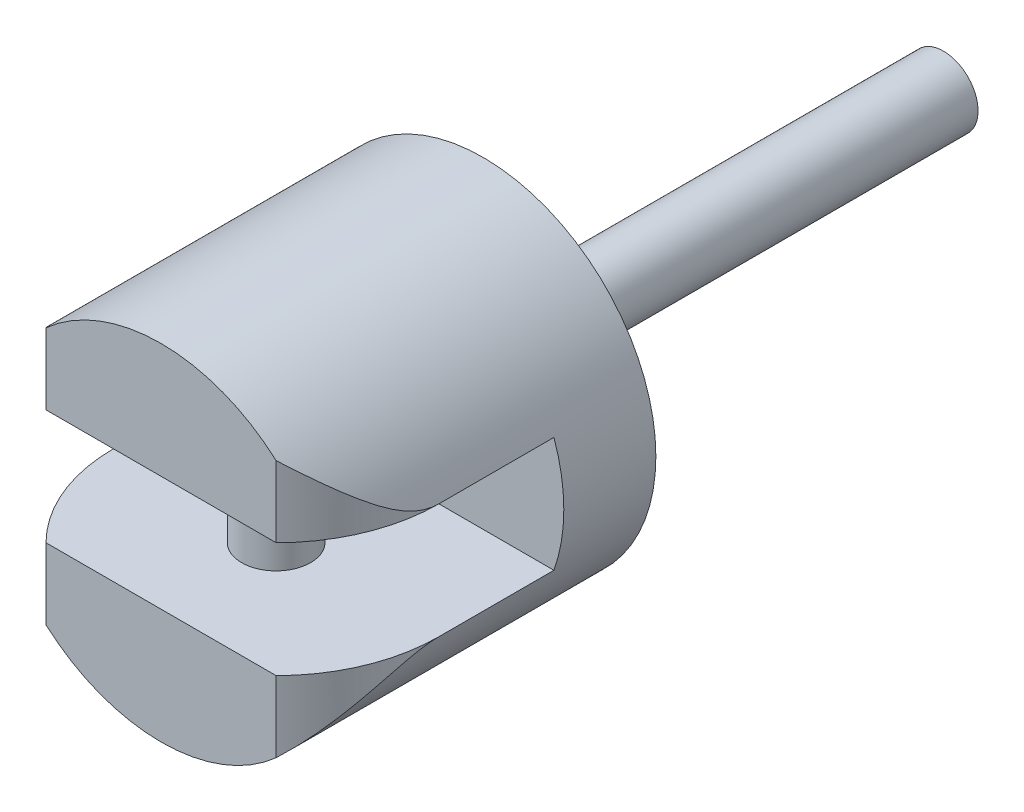
ISO-10303-21;
HEADER;
FILE_DESCRIPTION(('STEP AP214'),'2;1');
FILE_NAME('part.step','',(''),(''),'','','');
FILE_SCHEMA(('AUTOMOTIVE_DESIGN { 1 0 10303 214 1 1 1 1 }'));
ENDSEC;
DATA;
#1=APPLICATION_CONTEXT('core data for automotive mechanical design processes');
#2=APPLICATION_PROTOCOL_DEFINITION('international standard','automotive_design',2000,#1);
#3=PRODUCT_CONTEXT('',#1,'mechanical');
#4=PRODUCT('Part','Part','',(#3));
#5=PRODUCT_RELATED_PRODUCT_CATEGORY('part','',(#4));
#6=PRODUCT_DEFINITION_FORMATION('','',#4);
#7=PRODUCT_DEFINITION_CONTEXT('part definition',#1,'design');
#8=PRODUCT_DEFINITION('design','',#6,#7);
#9=PRODUCT_DEFINITION_SHAPE('','',#8);
#10=(LENGTH_UNIT() NAMED_UNIT(*) SI_UNIT(.MILLI.,.METRE.));
#11=(NAMED_UNIT(*) PLANE_ANGLE_UNIT() SI_UNIT($,.RADIAN.));
#12=(NAMED_UNIT(*) SI_UNIT($,.STERADIAN.) SOLID_ANGLE_UNIT());
#13=UNCERTAINTY_MEASURE_WITH_UNIT(LENGTH_MEASURE(1.E-05),#10,'distance_accuracy_value','');
#14=(GEOMETRIC_REPRESENTATION_CONTEXT(3) GLOBAL_UNCERTAINTY_ASSIGNED_CONTEXT((#13)) GLOBAL_UNIT_ASSIGNED_CONTEXT((#10,
#11,#12)) REPRESENTATION_CONTEXT('',''));
#15=CARTESIAN_POINT('',(0.,0.,0.));
#16=DIRECTION('',(0.,0.,1.));
#17=DIRECTION('',(1.,0.,0.));
#18=AXIS2_PLACEMENT_3D('',#15,#16,#17);
#19=CARTESIAN_POINT('',(0.,0.,40.));
#20=DIRECTION('',(0.,0.,-1.));
#21=DIRECTION('',(-1.,0.,0.));
#22=AXIS2_PLACEMENT_3D('',#19,#20,#21);
#23=CYLINDRICAL_SURFACE('',#22,75.);
#24=CARTESIAN_POINT('',(0.,0.,0.));
#25=DIRECTION('',(0.,0.,1.));
#26=DIRECTION('',(1.,0.,0.));
#27=AXIS2_PLACEMENT_3D('',#24,#25,#26);
#28=CIRCLE('',#27,75.);
#29=CARTESIAN_POINT('',(75.,0.,0.));
#30=VERTEX_POINT('',#29);
#31=EDGE_CURVE('E152',#30,#30,#28,.T.);
#32=ORIENTED_EDGE('',*,*,#31,.T.);
#33=EDGE_LOOP('',(#32));
#34=FACE_BOUND('',#33,.T.);
#35=CARTESIAN_POINT('',(-50.,55.9016994374947,140.));
#36=CARTESIAN_POINT('',(-50.4471607483027,55.5017451255967,139.552833539091));
#37=CARTESIAN_POINT('',(-50.8869348308672,55.0987429884566,139.101068268509));
#38=CARTESIAN_POINT('',(-51.7518329745256,54.2871946058657,138.188619486069));
#39=CARTESIAN_POINT('',(-52.1769575124843,53.8786485414825,137.727936265268));
#40=CARTESIAN_POINT('',(-53.4303839295943,52.645679833325,136.333108012427));
#41=CARTESIAN_POINT('',(-54.2369533553051,51.8137339636996,135.385969254587));
#42=CARTESIAN_POINT('',(-55.7935098678778,50.1337876534138,133.458260519685));
#43=CARTESIAN_POINT('',(-56.543450349325,49.2857746922854,132.477663950042));
#44=CARTESIAN_POINT('',(-57.9869999728488,47.5789554687238,130.484833294683));
#45=CARTESIAN_POINT('',(-58.6806067345314,46.7201487519667,129.472597874561));
#46=CARTESIAN_POINT('',(-60.0195958933229,44.9873320628578,127.405631045393));
#47=CARTESIAN_POINT('',(-60.6643630211661,44.1132588213194,126.350554382454));
#48=CARTESIAN_POINT('',(-61.8978256245699,42.3651194841771,124.208002252363));
#49=CARTESIAN_POINT('',(-62.4865182597134,41.4910533911754,123.120525147648));
#50=CARTESIAN_POINT('',(-63.6077990332285,39.7507040199705,120.91245968818));
#51=CARTESIAN_POINT('',(-64.140428277674,38.8844154715678,119.791896375383));
#52=CARTESIAN_POINT('',(-65.1500238336438,37.1680597886583,117.514115461867));
#53=CARTESIAN_POINT('',(-65.6270008998664,36.3179895466368,116.356904998291));
#54=CARTESIAN_POINT('',(-66.4263470947432,34.8294368347989,114.25919825072));
#55=CARTESIAN_POINT('',(-66.7596869582326,34.185422666996,113.326807142889));
#56=CARTESIAN_POINT('',(-67.3914135449823,32.9225666771076,111.433468032308));
#57=CARTESIAN_POINT('',(-67.6898015217152,32.3037239528235,110.472521055203));
#58=CARTESIAN_POINT('',(-68.2501827844644,31.1022747163517,108.518768575891));
#59=CARTESIAN_POINT('',(-68.5122023846493,30.5196421748037,107.525986754681));
#60=CARTESIAN_POINT('',(-68.9980282729177,29.4047807666676,105.503340586175));
#61=CARTESIAN_POINT('',(-69.2218453519084,28.8725376857582,104.473486810296));
#62=CARTESIAN_POINT('',(-69.5690994945685,28.0229578060447,102.6773988872));
#63=CARTESIAN_POINT('',(-69.702810970304,27.6881005070611,101.921470311479));
#64=CARTESIAN_POINT('',(-69.947860150658,27.0630643717184,100.387497738915));
#65=CARTESIAN_POINT('',(-70.0591956025663,26.7728900345117,99.6094515243642));
#66=CARTESIAN_POINT('',(-70.2570736156081,26.2492241500369,98.0355083858782));
#67=CARTESIAN_POINT('',(-70.343735556161,26.0154605353032,97.2397182217052));
#68=CARTESIAN_POINT('',(-70.4908565044235,25.6141596316633,95.6295350723351));
#69=CARTESIAN_POINT('',(-70.5513347278745,25.4465737840955,94.8151561926975));
#70=CARTESIAN_POINT('',(-70.6350310190156,25.2131821979663,93.3357199927336));
#71=CARTESIAN_POINT('',(-70.6632621452806,25.1337766445926,92.6731093341303));
#72=CARTESIAN_POINT('',(-70.691641677123,25.0537926250238,91.6743651952552));
#73=CARTESIAN_POINT('',(-70.6987738511222,25.0336511172486,91.3399123588628));
#74=CARTESIAN_POINT('',(-70.708294468237,25.0067428591615,90.6703188165184));
#75=CARTESIAN_POINT('',(-70.7106817216347,24.999979463213,90.3351779591362));
#76=CARTESIAN_POINT('',(-70.7106781186548,24.9999999999999,90.));
#77=B_SPLINE_CURVE_WITH_KNOTS('',3,(#35,#36,#37,#38,#39,#40,#41,#42,#43,#44,#45,#46,#47,#48,#49,
#50,#51,#52,#53,#54,#55,#56,#57,#58,#59,#60,#61,#62,#63,#64,#65,#66,#67,#68,#69,#70,#71,#72,#73,
#74,#75,#76),.UNSPECIFIED.,.F.,.F.,(4,2,2,2,2,2,2,2,2,2,2,2,2,2,2,2,2,2,2,2,4),(0.,
2.24461722278169,4.48916131072646,8.97717086504265,13.4688346638826,17.9606881603535,
22.5020139359566,27.04356962728,31.5817718758783,36.1190956661773,39.6617360524355,
43.2042493507598,46.7441859676835,50.2831210127475,52.7942338263427,55.3055993201878,
57.8045989945119,60.3017615779778,62.3032570375314,63.3083909087766,64.3137767705253),.UNSPECIFIED.);
#78=CARTESIAN_POINT('',(-50.,55.9016994374948,140.));
#79=VERTEX_POINT('',#78);
#80=CARTESIAN_POINT('',(-70.7106781186548,25.,90.));
#81=VERTEX_POINT('',#80);
#82=EDGE_CURVE('E213',#79,#81,#77,.T.);
#83=ORIENTED_EDGE('',*,*,#82,.F.);
#84=CARTESIAN_POINT('',(0.,0.,140.));
#85=DIRECTION('',(0.,0.,1.));
#86=DIRECTION('',(1.,0.,0.));
#87=AXIS2_PLACEMENT_3D('',#84,#85,#86);
#88=CIRCLE('',#87,75.);
#89=CARTESIAN_POINT('',(50.,55.9016994374948,140.));
#90=VERTEX_POINT('',#89);
#91=EDGE_CURVE('E167',#90,#79,#88,.T.);
#92=ORIENTED_EDGE('',*,*,#91,.F.);
#93=CARTESIAN_POINT('',(70.7106781186548,25.,90.));
#94=CARTESIAN_POINT('',(70.71069664,24.9999037239482,90.4591966566404));
#95=CARTESIAN_POINT('',(70.7062056844189,25.0126490802113,90.918354215152));
#96=CARTESIAN_POINT('',(70.6883459813921,25.0631011269385,91.8349637380874));
#97=CARTESIAN_POINT('',(70.6749804143905,25.100798875059,92.2924162545173));
#98=CARTESIAN_POINT('',(70.6395818305565,25.20023987016,93.2025359123625));
#99=CARTESIAN_POINT('',(70.6175829204928,25.2618884876571,93.6552147727632));
#100=CARTESIAN_POINT('',(70.5651699456891,25.407927905513,94.5563802699263));
#101=CARTESIAN_POINT('',(70.5347552569245,25.492320392303,95.0048665932645));
#102=CARTESIAN_POINT('',(70.4328464268791,25.773114610417,96.3228553791904));
#103=CARTESIAN_POINT('',(70.3498677914168,25.9994956446317,97.1852074308121));
#104=CARTESIAN_POINT('',(70.1553031320753,26.5199954287679,98.8864118724804));
#105=CARTESIAN_POINT('',(70.0436855884274,26.8141887759228,99.7252372335777));
#106=CARTESIAN_POINT('',(69.8207920938738,27.3885157038499,101.2022408254));
#107=CARTESIAN_POINT('',(69.7144696159016,27.6583856987452,101.845225208063));
#108=CARTESIAN_POINT('',(69.4865831703183,28.226020920803,103.116082915582));
#109=CARTESIAN_POINT('',(69.3650164108099,28.5237912552106,103.743953447257));
#110=CARTESIAN_POINT('',(69.1074338107972,29.1423212343323,104.985483193627));
#111=CARTESIAN_POINT('',(68.9714122948302,29.4630898928236,105.599136710164));
#112=CARTESIAN_POINT('',(68.6856165444134,30.123338185786,106.812935287153));
#113=CARTESIAN_POINT('',(68.5358430172439,30.462816857623,107.413081040348));
#114=CARTESIAN_POINT('',(68.2196997439472,31.1644627238597,108.613599314781));
#115=CARTESIAN_POINT('',(68.0530439672477,31.5269595532607,109.213703188681));
#116=CARTESIAN_POINT('',(67.706309476017,32.2648734090124,110.40192444328));
#117=CARTESIAN_POINT('',(67.5262307511406,32.6402904453208,110.990041814742));
#118=CARTESIAN_POINT('',(66.9663751944478,33.7819731884777,112.737685328915));
#119=CARTESIAN_POINT('',(66.5669063211661,34.563833544468,113.880776768079));
#120=CARTESIAN_POINT('',(65.683368993561,36.2166009609941,116.217862521279));
#121=CARTESIAN_POINT('',(65.1951077194911,37.0896590264,117.408728755374));
#122=CARTESIAN_POINT('',(64.1597771209223,38.8531732101764,119.751692585025));
#123=CARTESIAN_POINT('',(63.6126965840236,39.7436326191063,120.90378273375));
#124=CARTESIAN_POINT('',(62.4593809208052,41.5326325183435,123.172978061962));
#125=CARTESIAN_POINT('',(61.8531045084909,42.4311782461494,124.290058096017));
#126=CARTESIAN_POINT('',(60.581286594272,44.2280386628488,126.490022967266));
#127=CARTESIAN_POINT('',(59.9157486694529,45.1263533624091,127.572909863055));
#128=CARTESIAN_POINT('',(58.5613873550057,46.8691454747357,129.648672538627));
#129=CARTESIAN_POINT('',(57.8756526338992,47.7139594790385,130.64328100435));
#130=CARTESIAN_POINT('',(56.4495700180813,49.3929067339749,132.60179972503));
#131=CARTESIAN_POINT('',(55.7092248956424,50.2270405242655,133.565711534738));
#132=CARTESIAN_POINT('',(54.1736544575359,51.8795352978065,135.460985733273));
#133=CARTESIAN_POINT('',(53.3784772593276,52.6979093239244,136.392375606794));
#134=CARTESIAN_POINT('',(52.1434907927725,53.9109405027724,137.764370056649));
#135=CARTESIAN_POINT('',(51.7247386534705,54.3129103274674,138.217573113012));
#136=CARTESIAN_POINT('',(50.8730429522221,55.1114709117659,139.115336067717));
#137=CARTESIAN_POINT('',(50.4400989454209,55.5080615022014,139.559895694429));
#138=CARTESIAN_POINT('',(50.,55.9016994374947,140.));
#139=B_SPLINE_CURVE_WITH_KNOTS('',3,(#93,#94,#95,#96,#97,#98,#99,#100,#101,#102,#103,#104,#105,
#106,#107,#108,#109,#110,#111,#112,#113,#114,#115,#116,#117,#118,#119,#120,#121,#122,#123,#124,
#125,#126,#127,#128,#129,#130,#131,#132,#133,#134,#135,#136,#137,#138),.UNSPECIFIED.,.F.,.F.,(4,
2,2,2,2,2,2,2,2,2,2,2,2,2,2,2,2,2,2,2,2,2,4),(0.,1.37732730415904,2.75416127403436,
4.12560982879987,5.49716010285156,8.17913914004191,10.8640827004156,12.9792840690535,
15.094873391255,17.2112964614591,19.327610742721,21.4891024092348,23.6505957416502,
27.9726031384433,32.6365608525402,37.3014092134564,41.9695346210165,46.6373784465176,
51.0585714589686,55.4795401857878,59.8966775210212,62.1057806652428,64.3149531218),.UNSPECIFIED.);
#140=CARTESIAN_POINT('',(70.7106781186548,25.,90.));
#141=VERTEX_POINT('',#140);
#142=EDGE_CURVE('E221',#141,#90,#139,.T.);
#143=ORIENTED_EDGE('',*,*,#142,.F.);
#144=DIRECTION('',(0.,0.,-1.));
#145=VECTOR('',#144,1.);
#146=CARTESIAN_POINT('',(70.7106781186548,25.,140.));
#147=LINE('',#146,#145);
#148=CARTESIAN_POINT('',(70.7106781186548,25.,40.));
#149=VERTEX_POINT('',#148);
#150=EDGE_CURVE('E177',#141,#149,#147,.T.);
#151=ORIENTED_EDGE('',*,*,#150,.T.);
#152=CARTESIAN_POINT('',(0.,0.,40.));
#153=DIRECTION('',(0.,0.,1.));
#154=DIRECTION('',(1.,0.,0.));
#155=AXIS2_PLACEMENT_3D('',#152,#153,#154);
#156=CIRCLE('',#155,75.);
#157=CARTESIAN_POINT('',(70.7106781186548,-25.,40.));
#158=VERTEX_POINT('',#157);
#159=EDGE_CURVE('E132',#158,#149,#156,.T.);
#160=ORIENTED_EDGE('',*,*,#159,.F.);
#161=DIRECTION('',(0.,0.,-1.));
#162=VECTOR('',#161,1.);
#163=CARTESIAN_POINT('',(70.7106781186548,-25.,140.));
#164=LINE('',#163,#162);
#165=CARTESIAN_POINT('',(70.7106781186548,-25.,90.));
#166=VERTEX_POINT('',#165);
#167=EDGE_CURVE('E122',#166,#158,#164,.T.);
#168=ORIENTED_EDGE('',*,*,#167,.F.);
#169=CARTESIAN_POINT('',(50.,-55.9016994374947,140.));
#170=CARTESIAN_POINT('',(50.4471607483027,-55.5017451255967,139.552833539091));
#171=CARTESIAN_POINT('',(50.8869348308672,-55.0987429884566,139.101068268509));
#172=CARTESIAN_POINT('',(51.7518329745256,-54.2871946058657,138.188619486069));
#173=CARTESIAN_POINT('',(52.1769575124843,-53.8786485414825,137.727936265268));
#174=CARTESIAN_POINT('',(53.4303839295943,-52.645679833325,136.333108012427));
#175=CARTESIAN_POINT('',(54.2369533553051,-51.8137339636997,135.385969254587));
#176=CARTESIAN_POINT('',(55.7935098678778,-50.1337876534138,133.458260519685));
#177=CARTESIAN_POINT('',(56.5434503493249,-49.2857746922854,132.477663950042));
#178=CARTESIAN_POINT('',(57.9869999728487,-47.5789554687238,130.484833294683));
#179=CARTESIAN_POINT('',(58.6806067345313,-46.7201487519667,129.472597874561));
#180=CARTESIAN_POINT('',(60.0195958933229,-44.9873320628578,127.405631045393));
#181=CARTESIAN_POINT('',(60.664363021166,-44.1132588213194,126.350554382454));
#182=CARTESIAN_POINT('',(61.8978256245699,-42.3651194841771,124.208002252364));
#183=CARTESIAN_POINT('',(62.4865182597134,-41.4910533911754,123.120525147648));
#184=CARTESIAN_POINT('',(63.6077990332285,-39.7507040199705,120.91245968818));
#185=CARTESIAN_POINT('',(64.140428277674,-38.8844154715678,119.791896375383));
#186=CARTESIAN_POINT('',(65.1500238336438,-37.1680597886583,117.514115461867));
#187=CARTESIAN_POINT('',(65.6270008998664,-36.3179895466368,116.356904998291));
#188=CARTESIAN_POINT('',(66.4263470947433,-34.8294368347989,114.25919825072));
#189=CARTESIAN_POINT('',(66.7596869582326,-34.185422666996,113.326807142889));
#190=CARTESIAN_POINT('',(67.3914135449823,-32.9225666771076,111.433468032308));
#191=CARTESIAN_POINT('',(67.6898015217152,-32.3037239528235,110.472521055203));
#192=CARTESIAN_POINT('',(68.2501827844644,-31.1022747163517,108.518768575891));
#193=CARTESIAN_POINT('',(68.5122023846493,-30.5196421748037,107.525986754681));
#194=CARTESIAN_POINT('',(68.9980282729177,-29.4047807666676,105.503340586175));
#195=CARTESIAN_POINT('',(69.2218453519084,-28.8725376857583,104.473486810296));
#196=CARTESIAN_POINT('',(69.5690994945685,-28.0229578060447,102.6773988872));
#197=CARTESIAN_POINT('',(69.7028109703039,-27.6881005070611,101.921470311479));
#198=CARTESIAN_POINT('',(69.947860150658,-27.0630643717184,100.387497738915));
#199=CARTESIAN_POINT('',(70.0591956025663,-26.7728900345117,99.6094515243643));
#200=CARTESIAN_POINT('',(70.2570736156081,-26.249224150037,98.0355083858782));
#201=CARTESIAN_POINT('',(70.343735556161,-26.0154605353032,97.2397182217051));
#202=CARTESIAN_POINT('',(70.4908565044235,-25.6141596316633,95.6295350723351));
#203=CARTESIAN_POINT('',(70.5513347278745,-25.4465737840956,94.8151561926975));
#204=CARTESIAN_POINT('',(70.6350310190156,-25.2131821979663,93.3357199927336));
#205=CARTESIAN_POINT('',(70.6632621452806,-25.1337766445926,92.6731093341303));
#206=CARTESIAN_POINT('',(70.691641677123,-25.0537926250238,91.6743651952552));
#207=CARTESIAN_POINT('',(70.6987738511222,-25.0336511172486,91.3399123588628));
#208=CARTESIAN_POINT('',(70.708294468237,-25.0067428591615,90.6703188165184));
#209=CARTESIAN_POINT('',(70.7106817216347,-24.999979463213,90.3351779591362));
#210=CARTESIAN_POINT('',(70.7106781186548,-24.9999999999999,90.));
#211=B_SPLINE_CURVE_WITH_KNOTS('',3,(#169,#170,#171,#172,#173,#174,#175,#176,#177,#178,#179,
#180,#181,#182,#183,#184,#185,#186,#187,#188,#189,#190,#191,#192,#193,#194,#195,#196,#197,#198,
#199,#200,#201,#202,#203,#204,#205,#206,#207,#208,#209,#210),.UNSPECIFIED.,.F.,.F.,(4,2,2,2,2,2,
2,2,2,2,2,2,2,2,2,2,2,2,2,2,4),(0.,2.24461722278169,4.48916131072646,8.97717086504263,
13.4688346638826,17.9606881603535,22.5020139359566,27.04356962728,31.5817718758783,
36.1190956661773,39.6617360524355,43.2042493507598,46.7441859676835,50.2831210127475,
52.7942338263426,55.3055993201878,57.8045989945119,60.3017615779778,62.3032570375314,
63.3083909087766,64.3137767705253),.UNSPECIFIED.);
#212=CARTESIAN_POINT('',(50.,-55.9016994374948,140.));
#213=VERTEX_POINT('',#212);
#214=EDGE_CURVE('E109',#213,#166,#211,.T.);
#215=ORIENTED_EDGE('',*,*,#214,.F.);
#216=CARTESIAN_POINT('',(0.,0.,140.));
#217=DIRECTION('',(0.,0.,1.));
#218=DIRECTION('',(1.,0.,0.));
#219=AXIS2_PLACEMENT_3D('',#216,#217,#218);
#220=CIRCLE('',#219,75.);
#221=CARTESIAN_POINT('',(-50.,-55.9016994374948,140.));
#222=VERTEX_POINT('',#221);
#223=EDGE_CURVE('E146',#222,#213,#220,.T.);
#224=ORIENTED_EDGE('',*,*,#223,.F.);
#225=CARTESIAN_POINT('',(-70.7106781186548,-25.,90.));
#226=CARTESIAN_POINT('',(-70.71069664,-24.9999037239483,90.4591966566404));
#227=CARTESIAN_POINT('',(-70.7062056844189,-25.0126490802113,90.918354215152));
#228=CARTESIAN_POINT('',(-70.6883459813921,-25.0631011269385,91.8349637380874));
#229=CARTESIAN_POINT('',(-70.6749804143905,-25.100798875059,92.2924162545173));
#230=CARTESIAN_POINT('',(-70.6395818305565,-25.20023987016,93.2025359123625));
#231=CARTESIAN_POINT('',(-70.6175829204928,-25.2618884876571,93.6552147727632));
#232=CARTESIAN_POINT('',(-70.5651699456891,-25.407927905513,94.5563802699263));
#233=CARTESIAN_POINT('',(-70.5347552569245,-25.4923203923029,95.0048665932645));
#234=CARTESIAN_POINT('',(-70.4328464268792,-25.7731146104169,96.3228553791903));
#235=CARTESIAN_POINT('',(-70.3498677914168,-25.9994956446317,97.185207430812));
#236=CARTESIAN_POINT('',(-70.1553031320753,-26.519995428768,98.8864118724804));
#237=CARTESIAN_POINT('',(-70.0436855884274,-26.8141887759228,99.7252372335777));
#238=CARTESIAN_POINT('',(-69.8207920938738,-27.3885157038499,101.2022408254));
#239=CARTESIAN_POINT('',(-69.7144696159016,-27.6583856987452,101.845225208063));
#240=CARTESIAN_POINT('',(-69.4865831703183,-28.226020920803,103.116082915582));
#241=CARTESIAN_POINT('',(-69.3650164108099,-28.5237912552106,103.743953447257));
#242=CARTESIAN_POINT('',(-69.1074338107972,-29.1423212343323,104.985483193627));
#243=CARTESIAN_POINT('',(-68.9714122948302,-29.4630898928236,105.599136710164));
#244=CARTESIAN_POINT('',(-68.6856165444134,-30.123338185786,106.812935287153));
#245=CARTESIAN_POINT('',(-68.5358430172439,-30.462816857623,107.413081040348));
#246=CARTESIAN_POINT('',(-68.2196997439473,-31.1644627238597,108.613599314781));
#247=CARTESIAN_POINT('',(-68.0530439672477,-31.5269595532607,109.21370318868));
#248=CARTESIAN_POINT('',(-67.706309476017,-32.2648734090124,110.40192444328));
#249=CARTESIAN_POINT('',(-67.5262307511406,-32.6402904453208,110.990041814742));
#250=CARTESIAN_POINT('',(-66.9663751944478,-33.7819731884777,112.737685328915));
#251=CARTESIAN_POINT('',(-66.5669063211661,-34.563833544468,113.880776768079));
#252=CARTESIAN_POINT('',(-65.683368993561,-36.2166009609941,116.217862521279));
#253=CARTESIAN_POINT('',(-65.1951077194911,-37.0896590264,117.408728755374));
#254=CARTESIAN_POINT('',(-64.1597771209223,-38.8531732101764,119.751692585025));
#255=CARTESIAN_POINT('',(-63.6126965840236,-39.7436326191063,120.90378273375));
#256=CARTESIAN_POINT('',(-62.4593809208052,-41.5326325183435,123.172978061962));
#257=CARTESIAN_POINT('',(-61.8531045084909,-42.4311782461494,124.290058096017));
#258=CARTESIAN_POINT('',(-60.581286594272,-44.2280386628488,126.490022967266));
#259=CARTESIAN_POINT('',(-59.9157486694529,-45.1263533624091,127.572909863055));
#260=CARTESIAN_POINT('',(-58.5613873550057,-46.8691454747357,129.648672538627));
#261=CARTESIAN_POINT('',(-57.8756526338992,-47.7139594790385,130.64328100435));
#262=CARTESIAN_POINT('',(-56.4495700180813,-49.3929067339749,132.60179972503));
#263=CARTESIAN_POINT('',(-55.7092248956424,-50.2270405242655,133.565711534738));
#264=CARTESIAN_POINT('',(-54.1736544575359,-51.8795352978065,135.460985733273));
#265=CARTESIAN_POINT('',(-53.3784772593276,-52.6979093239244,136.392375606794));
#266=CARTESIAN_POINT('',(-52.1434907927725,-53.9109405027724,137.764370056649));
#267=CARTESIAN_POINT('',(-51.7247386534705,-54.3129103274673,138.217573113012));
#268=CARTESIAN_POINT('',(-50.8730429522221,-55.1114709117659,139.115336067717));
#269=CARTESIAN_POINT('',(-50.4400989454209,-55.5080615022014,139.559895694429));
#270=CARTESIAN_POINT('',(-50.,-55.9016994374947,140.));
#271=B_SPLINE_CURVE_WITH_KNOTS('',3,(#225,#226,#227,#228,#229,#230,#231,#232,#233,#234,#235,
#236,#237,#238,#239,#240,#241,#242,#243,#244,#245,#246,#247,#248,#249,#250,#251,#252,#253,#254,
#255,#256,#257,#258,#259,#260,#261,#262,#263,#264,#265,#266,#267,#268,#269,#270),.UNSPECIFIED.,
.F.,.F.,(4,2,2,2,2,2,2,2,2,2,2,2,2,2,2,2,2,2,2,2,2,2,4),(0.,1.37732730415904,2.75416127403437,
4.12560982879989,5.49716010285155,8.17913914004189,10.8640827004156,12.9792840690535,
15.094873391255,17.2112964614591,19.327610742721,21.4891024092348,23.6505957416502,
27.9726031384433,32.6365608525401,37.3014092134564,41.9695346210165,46.6373784465176,
51.0585714589686,55.4795401857878,59.8966775210212,62.1057806652428,64.3149531218),.UNSPECIFIED.);
#272=CARTESIAN_POINT('',(-70.7106781186548,-25.,90.));
#273=VERTEX_POINT('',#272);
#274=EDGE_CURVE('E69',#273,#222,#271,.T.);
#275=ORIENTED_EDGE('',*,*,#274,.F.);
#276=DIRECTION('',(0.,0.,-1.));
#277=VECTOR('',#276,1.);
#278=CARTESIAN_POINT('',(-70.7106781186548,-25.,140.));
#279=LINE('',#278,#277);
#280=CARTESIAN_POINT('',(-70.7106781186548,-25.,40.));
#281=VERTEX_POINT('',#280);
#282=EDGE_CURVE('E133',#273,#281,#279,.T.);
#283=ORIENTED_EDGE('',*,*,#282,.T.);
#284=CARTESIAN_POINT('',(-70.7106781186548,25.,40.));
#285=VERTEX_POINT('',#284);
#286=EDGE_CURVE('E156',#285,#281,#156,.T.);
#287=ORIENTED_EDGE('',*,*,#286,.F.);
#288=DIRECTION('',(0.,0.,-1.));
#289=VECTOR('',#288,1.);
#290=CARTESIAN_POINT('',(-70.7106781186548,25.,140.));
#291=LINE('',#290,#289);
#292=EDGE_CURVE('E140',#81,#285,#291,.T.);
#293=ORIENTED_EDGE('',*,*,#292,.F.);
#294=EDGE_LOOP('',(#83,#92,#143,#151,#160,#168,#215,#224,#275,#283,#287,#293));
#295=FACE_BOUND('',#294,.T.);
#296=ADVANCED_FACE('F46',(#34,#295),#23,.T.);
#297=CARTESIAN_POINT('',(70.7106781186548,-25.,140.));
#298=DIRECTION('',(0.,-1.,0.));
#299=DIRECTION('',(0.,0.,-1.));
#300=AXIS2_PLACEMENT_3D('',#297,#298,#299);
#301=PLANE('',#300);
#302=CARTESIAN_POINT('',(0.,-25.,90.));
#303=DIRECTION('',(0.,-1.,0.));
#304=DIRECTION('',(1.,0.,0.));
#305=AXIS2_PLACEMENT_3D('',#302,#303,#304);
#306=CIRCLE('',#305,15.);
#307=CARTESIAN_POINT('',(15.,-25.,90.));
#308=VERTEX_POINT('',#307);
#309=EDGE_CURVE('E134',#308,#308,#306,.T.);
#310=ORIENTED_EDGE('',*,*,#309,.T.);
#311=EDGE_LOOP('',(#310));
#312=FACE_BOUND('',#311,.T.);
#313=CARTESIAN_POINT('',(0.,-25.,90.));
#314=DIRECTION('',(0.,-1.,0.));
#315=DIRECTION('',(0.,0.,-1.));
#316=AXIS2_PLACEMENT_3D('',#313,#314,#315);
#317=CIRCLE('',#316,70.7106781186548);
#318=CARTESIAN_POINT('',(50.,-25.,140.));
#319=VERTEX_POINT('',#318);
#320=EDGE_CURVE('E61',#166,#319,#317,.T.);
#321=ORIENTED_EDGE('',*,*,#320,.F.);
#322=ORIENTED_EDGE('',*,*,#167,.T.);
#323=DIRECTION('',(-1.,0.,0.));
#324=VECTOR('',#323,1.);
#325=CARTESIAN_POINT('',(70.7106781186548,-25.,40.));
#326=LINE('',#325,#324);
#327=EDGE_CURVE('E143',#158,#281,#326,.T.);
#328=ORIENTED_EDGE('',*,*,#327,.T.);
#329=ORIENTED_EDGE('',*,*,#282,.F.);
#330=CARTESIAN_POINT('',(-50.,-25.,140.));
#331=VERTEX_POINT('',#330);
#332=EDGE_CURVE('E128',#331,#273,#317,.T.);
#333=ORIENTED_EDGE('',*,*,#332,.F.);
#334=DIRECTION('',(-1.,0.,0.));
#335=VECTOR('',#334,1.);
#336=CARTESIAN_POINT('',(70.7106781186548,-25.,140.));
#337=LINE('',#336,#335);
#338=EDGE_CURVE('E126',#319,#331,#337,.T.);
#339=ORIENTED_EDGE('',*,*,#338,.F.);
#340=EDGE_LOOP('',(#321,#322,#328,#329,#333,#339));
#341=FACE_BOUND('',#340,.T.);
#342=ADVANCED_FACE('F120',(#312,#341),#301,.F.);
#343=CARTESIAN_POINT('',(0.,0.,140.));
#344=DIRECTION('',(0.,0.,1.));
#345=DIRECTION('',(1.,0.,0.));
#346=AXIS2_PLACEMENT_3D('',#343,#344,#345);
#347=PLANE('',#346);
#348=ORIENTED_EDGE('',*,*,#223,.T.);
#349=DIRECTION('',(0.,1.,0.));
#350=VECTOR('',#349,1.);
#351=CARTESIAN_POINT('',(50.,-75.,140.));
#352=LINE('',#351,#350);
#353=EDGE_CURVE('E111',#213,#319,#352,.T.);
#354=ORIENTED_EDGE('',*,*,#353,.T.);
#355=ORIENTED_EDGE('',*,*,#338,.T.);
#356=DIRECTION('',(0.,1.,0.));
#357=VECTOR('',#356,1.);
#358=CARTESIAN_POINT('',(-50.,-75.,140.));
#359=LINE('',#358,#357);
#360=EDGE_CURVE('E188',#331,#222,#359,.F.);
#361=ORIENTED_EDGE('',*,*,#360,.T.);
#362=EDGE_LOOP('',(#348,#354,#355,#361));
#363=FACE_BOUND('',#362,.T.);
#364=ADVANCED_FACE('F190',(#363),#347,.T.);
#365=CARTESIAN_POINT('',(-70.7106781186548,25.,140.));
#366=DIRECTION('',(0.,1.,0.));
#367=DIRECTION('',(0.,0.,1.));
#368=AXIS2_PLACEMENT_3D('',#365,#366,#367);
#369=PLANE('',#368);
#370=CARTESIAN_POINT('',(0.,25.,90.));
#371=DIRECTION('',(0.,-1.,0.));
#372=DIRECTION('',(1.,0.,0.));
#373=AXIS2_PLACEMENT_3D('',#370,#371,#372);
#374=CIRCLE('',#373,15.);
#375=CARTESIAN_POINT('',(15.,25.,90.));
#376=VERTEX_POINT('',#375);
#377=EDGE_CURVE('E116',#376,#376,#374,.T.);
#378=ORIENTED_EDGE('',*,*,#377,.F.);
#379=EDGE_LOOP('',(#378));
#380=FACE_BOUND('',#379,.T.);
#381=CARTESIAN_POINT('',(0.,25.,90.));
#382=DIRECTION('',(0.,1.,0.));
#383=DIRECTION('',(0.,0.,1.));
#384=AXIS2_PLACEMENT_3D('',#381,#382,#383);
#385=CIRCLE('',#384,70.7106781186548);
#386=CARTESIAN_POINT('',(50.,25.,140.));
#387=VERTEX_POINT('',#386);
#388=EDGE_CURVE('E176',#387,#141,#385,.T.);
#389=ORIENTED_EDGE('',*,*,#388,.F.);
#390=DIRECTION('',(1.,0.,0.));
#391=VECTOR('',#390,1.);
#392=CARTESIAN_POINT('',(-70.7106781186548,25.,140.));
#393=LINE('',#392,#391);
#394=CARTESIAN_POINT('',(-50.,25.,140.));
#395=VERTEX_POINT('',#394);
#396=EDGE_CURVE('E165',#395,#387,#393,.T.);
#397=ORIENTED_EDGE('',*,*,#396,.F.);
#398=EDGE_CURVE('E173',#81,#395,#385,.T.);
#399=ORIENTED_EDGE('',*,*,#398,.F.);
#400=ORIENTED_EDGE('',*,*,#292,.T.);
#401=DIRECTION('',(1.,0.,0.));
#402=VECTOR('',#401,1.);
#403=CARTESIAN_POINT('',(-70.7106781186548,25.,40.));
#404=LINE('',#403,#402);
#405=EDGE_CURVE('E145',#285,#149,#404,.T.);
#406=ORIENTED_EDGE('',*,*,#405,.T.);
#407=ORIENTED_EDGE('',*,*,#150,.F.);
#408=EDGE_LOOP('',(#389,#397,#399,#400,#406,#407));
#409=FACE_BOUND('',#408,.T.);
#410=ADVANCED_FACE('F172',(#380,#409),#369,.F.);
#411=CARTESIAN_POINT('',(0.,0.,140.));
#412=DIRECTION('',(0.,0.,1.));
#413=DIRECTION('',(1.,0.,0.));
#414=AXIS2_PLACEMENT_3D('',#411,#412,#413);
#415=PLANE('',#414);
#416=ORIENTED_EDGE('',*,*,#396,.T.);
#417=DIRECTION('',(0.,1.,0.));
#418=VECTOR('',#417,1.);
#419=CARTESIAN_POINT('',(50.,-75.,140.));
#420=LINE('',#419,#418);
#421=EDGE_CURVE('E12',#387,#90,#420,.T.);
#422=ORIENTED_EDGE('',*,*,#421,.T.);
#423=ORIENTED_EDGE('',*,*,#91,.T.);
#424=DIRECTION('',(0.,1.,0.));
#425=VECTOR('',#424,1.);
#426=CARTESIAN_POINT('',(-50.,-75.,140.));
#427=LINE('',#426,#425);
#428=EDGE_CURVE('E54',#79,#395,#427,.F.);
#429=ORIENTED_EDGE('',*,*,#428,.T.);
#430=EDGE_LOOP('',(#416,#422,#423,#429));
#431=FACE_BOUND('',#430,.T.);
#432=ADVANCED_FACE('F164',(#431),#415,.T.);
#433=CARTESIAN_POINT('',(0.,0.,40.));
#434=DIRECTION('',(0.,0.,1.));
#435=DIRECTION('',(1.,0.,0.));
#436=AXIS2_PLACEMENT_3D('',#433,#434,#435);
#437=PLANE('',#436);
#438=ORIENTED_EDGE('',*,*,#405,.F.);
#439=ORIENTED_EDGE('',*,*,#286,.T.);
#440=ORIENTED_EDGE('',*,*,#327,.F.);
#441=ORIENTED_EDGE('',*,*,#159,.T.);
#442=EDGE_LOOP('',(#438,#439,#440,#441));
#443=FACE_BOUND('',#442,.T.);
#444=ADVANCED_FACE('F186',(#443),#437,.T.);
#445=CARTESIAN_POINT('',(0.,0.,0.));
#446=DIRECTION('',(0.,0.,1.));
#447=DIRECTION('',(1.,0.,0.));
#448=AXIS2_PLACEMENT_3D('',#445,#446,#447);
#449=PLANE('',#448);
#450=CARTESIAN_POINT('',(0.,0.,0.));
#451=DIRECTION('',(0.,0.,-1.));
#452=DIRECTION('',(-1.,0.,0.));
#453=AXIS2_PLACEMENT_3D('',#450,#451,#452);
#454=CIRCLE('',#453,15.);
#455=CARTESIAN_POINT('',(-15.,0.,0.));
#456=VERTEX_POINT('',#455);
#457=EDGE_CURVE('E153',#456,#456,#454,.T.);
#458=ORIENTED_EDGE('',*,*,#457,.F.);
#459=EDGE_LOOP('',(#458));
#460=FACE_BOUND('',#459,.T.);
#461=ORIENTED_EDGE('',*,*,#31,.F.);
#462=EDGE_LOOP('',(#461));
#463=FACE_BOUND('',#462,.T.);
#464=ADVANCED_FACE('F247',(#460,#463),#449,.F.);
#465=CARTESIAN_POINT('',(0.,0.,-200.));
#466=DIRECTION('',(0.,0.,1.));
#467=DIRECTION('',(1.,0.,0.));
#468=AXIS2_PLACEMENT_3D('',#465,#466,#467);
#469=CYLINDRICAL_SURFACE('',#468,15.);
#470=CARTESIAN_POINT('',(0.,0.,-200.));
#471=DIRECTION('',(0.,0.,-1.));
#472=DIRECTION('',(-1.,0.,0.));
#473=AXIS2_PLACEMENT_3D('',#470,#471,#472);
#474=CIRCLE('',#473,15.);
#475=CARTESIAN_POINT('',(-15.,0.,-200.));
#476=VERTEX_POINT('',#475);
#477=EDGE_CURVE('E149',#476,#476,#474,.T.);
#478=ORIENTED_EDGE('',*,*,#477,.F.);
#479=EDGE_LOOP('',(#478));
#480=FACE_BOUND('',#479,.T.);
#481=ORIENTED_EDGE('',*,*,#457,.T.);
#482=EDGE_LOOP('',(#481));
#483=FACE_BOUND('',#482,.T.);
#484=ADVANCED_FACE('F249',(#480,#483),#469,.T.);
#485=CARTESIAN_POINT('',(0.,0.,-200.));
#486=DIRECTION('',(0.,0.,-1.));
#487=DIRECTION('',(-1.,0.,0.));
#488=AXIS2_PLACEMENT_3D('',#485,#486,#487);
#489=PLANE('',#488);
#490=ORIENTED_EDGE('',*,*,#477,.T.);
#491=EDGE_LOOP('',(#490));
#492=FACE_BOUND('',#491,.T.);
#493=ADVANCED_FACE('F236',(#492),#489,.T.);
#494=CARTESIAN_POINT('',(0.,25.,90.));
#495=DIRECTION('',(0.,-1.,0.));
#496=DIRECTION('',(1.,0.,0.));
#497=AXIS2_PLACEMENT_3D('',#494,#495,#496);
#498=CYLINDRICAL_SURFACE('',#497,15.);
#499=ORIENTED_EDGE('',*,*,#309,.F.);
#500=EDGE_LOOP('',(#499));
#501=FACE_BOUND('',#500,.T.);
#502=ORIENTED_EDGE('',*,*,#377,.T.);
#503=EDGE_LOOP('',(#502));
#504=FACE_BOUND('',#503,.T.);
#505=ADVANCED_FACE('F208',(#501,#504),#498,.T.);
#506=CARTESIAN_POINT('',(0.,-75.,90.));
#507=DIRECTION('',(0.,1.,0.));
#508=DIRECTION('',(0.,0.,1.));
#509=AXIS2_PLACEMENT_3D('',#506,#507,#508);
#510=CYLINDRICAL_SURFACE('',#509,70.7106781186548);
#511=ORIENTED_EDGE('',*,*,#82,.T.);
#512=ORIENTED_EDGE('',*,*,#398,.T.);
#513=ORIENTED_EDGE('',*,*,#428,.F.);
#514=EDGE_LOOP('',(#511,#512,#513));
#515=FACE_BOUND('',#514,.T.);
#516=ADVANCED_FACE('F207',(#515),#510,.T.);
#517=ORIENTED_EDGE('',*,*,#142,.T.);
#518=ORIENTED_EDGE('',*,*,#421,.F.);
#519=ORIENTED_EDGE('',*,*,#388,.T.);
#520=EDGE_LOOP('',(#517,#518,#519));
#521=FACE_BOUND('',#520,.T.);
#522=ADVANCED_FACE('F230',(#521),#510,.T.);
#523=ORIENTED_EDGE('',*,*,#274,.T.);
#524=ORIENTED_EDGE('',*,*,#360,.F.);
#525=ORIENTED_EDGE('',*,*,#332,.T.);
#526=EDGE_LOOP('',(#523,#524,#525));
#527=FACE_BOUND('',#526,.T.);
#528=ADVANCED_FACE('F206',(#527),#510,.T.);
#529=ORIENTED_EDGE('',*,*,#214,.T.);
#530=ORIENTED_EDGE('',*,*,#320,.T.);
#531=ORIENTED_EDGE('',*,*,#353,.F.);
#532=EDGE_LOOP('',(#529,#530,#531));
#533=FACE_BOUND('',#532,.T.);
#534=ADVANCED_FACE('F110',(#533),#510,.T.);
#535=CLOSED_SHELL('',(#296,#342,#364,#410,#432,#444,#464,#484,#493,#505,#516,#522,#528,#534));
#536=MANIFOLD_SOLID_BREP('B2',#535);
#537=ADVANCED_BREP_SHAPE_REPRESENTATION('',(#18,#536),#14);
#538=SHAPE_DEFINITION_REPRESENTATION(#9,#537);
ENDSEC;
END-ISO-10303-21;
